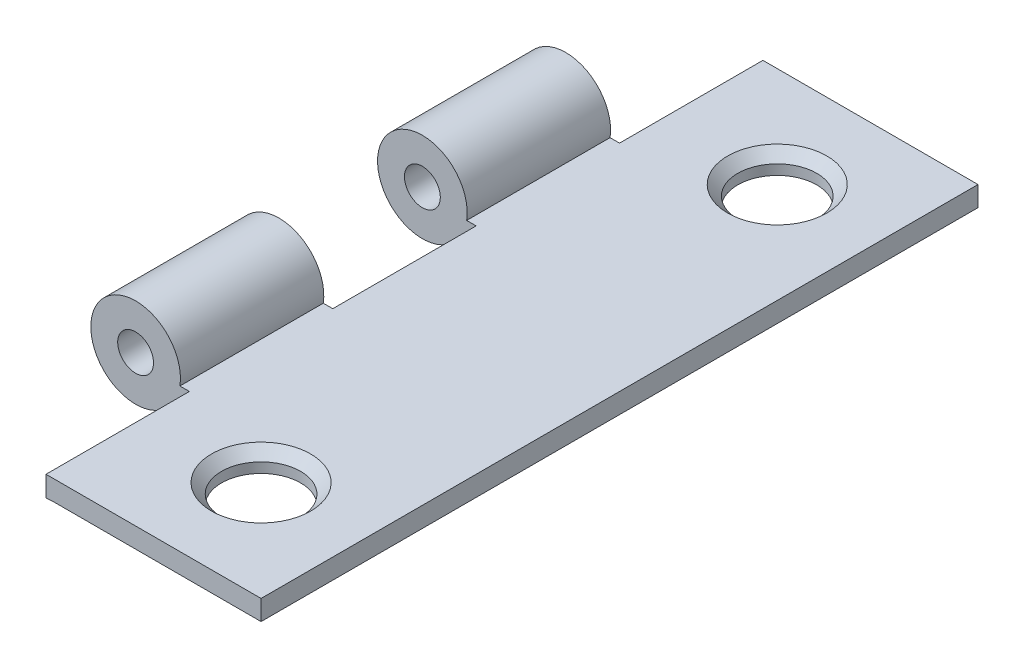
ISO-10303-21;
HEADER;
FILE_DESCRIPTION(('STEP AP214'),'2;1');
FILE_NAME('part.step','',(''),(''),'','','');
FILE_SCHEMA(('AUTOMOTIVE_DESIGN { 1 0 10303 214 1 1 1 1 }'));
ENDSEC;
DATA;
#1=APPLICATION_CONTEXT('core data for automotive mechanical design processes');
#2=APPLICATION_PROTOCOL_DEFINITION('international standard','automotive_design',2000,#1);
#3=PRODUCT_CONTEXT('',#1,'mechanical');
#4=PRODUCT('Part','Part','',(#3));
#5=PRODUCT_RELATED_PRODUCT_CATEGORY('part','',(#4));
#6=PRODUCT_DEFINITION_FORMATION('','',#4);
#7=PRODUCT_DEFINITION_CONTEXT('part definition',#1,'design');
#8=PRODUCT_DEFINITION('design','',#6,#7);
#9=PRODUCT_DEFINITION_SHAPE('','',#8);
#10=(LENGTH_UNIT() NAMED_UNIT(*) SI_UNIT(.MILLI.,.METRE.));
#11=(NAMED_UNIT(*) PLANE_ANGLE_UNIT() SI_UNIT($,.RADIAN.));
#12=(NAMED_UNIT(*) SI_UNIT($,.STERADIAN.) SOLID_ANGLE_UNIT());
#13=UNCERTAINTY_MEASURE_WITH_UNIT(LENGTH_MEASURE(1.E-05),#10,'distance_accuracy_value','');
#14=(GEOMETRIC_REPRESENTATION_CONTEXT(3) GLOBAL_UNCERTAINTY_ASSIGNED_CONTEXT((#13)) GLOBAL_UNIT_ASSIGNED_CONTEXT((#10,
#11,#12)) REPRESENTATION_CONTEXT('',''));
#15=CARTESIAN_POINT('',(0.,0.,0.));
#16=DIRECTION('',(0.,0.,1.));
#17=DIRECTION('',(1.,0.,0.));
#18=AXIS2_PLACEMENT_3D('',#15,#16,#17);
#19=CARTESIAN_POINT('',(0.,-0.4826,25.4));
#20=DIRECTION('',(0.,-1.,0.));
#21=DIRECTION('',(1.,0.,0.));
#22=AXIS2_PLACEMENT_3D('',#19,#20,#21);
#23=PLANE('',#22);
#24=CARTESIAN_POINT('',(11.9380000429728,-0.482599999999999,-18.288));
#25=DIRECTION('',(0.,-1.,0.));
#26=DIRECTION('',(1.,0.,0.));
#27=AXIS2_PLACEMENT_3D('',#24,#25,#26);
#28=CIRCLE('',#27,3.5112);
#29=CARTESIAN_POINT('',(15.4492000429728,-0.482599999999998,-18.288));
#30=VERTEX_POINT('',#29);
#31=EDGE_CURVE('E46',#30,#30,#28,.T.);
#32=ORIENTED_EDGE('',*,*,#31,.T.);
#33=EDGE_LOOP('',(#32));
#34=FACE_BOUND('',#33,.T.);
#35=CARTESIAN_POINT('',(11.9380000429728,-0.482599999999999,18.288));
#36=DIRECTION('',(0.,-1.,0.));
#37=DIRECTION('',(1.,0.,0.));
#38=AXIS2_PLACEMENT_3D('',#35,#36,#37);
#39=CIRCLE('',#38,3.5112);
#40=CARTESIAN_POINT('',(15.4492000429728,-0.482599999999998,18.288));
#41=VERTEX_POINT('',#40);
#42=EDGE_CURVE('E240',#41,#41,#39,.T.);
#43=ORIENTED_EDGE('',*,*,#42,.T.);
#44=EDGE_LOOP('',(#43));
#45=FACE_BOUND('',#44,.T.);
#46=DIRECTION('',(-1.,0.,0.));
#47=VECTOR('',#46,1.);
#48=CARTESIAN_POINT('',(0.,-0.4826,15.24));
#49=LINE('',#48,#47);
#50=CARTESIAN_POINT('',(3.81,-0.4826,15.24));
#51=VERTEX_POINT('',#50);
#52=CARTESIAN_POINT('',(3.13810806697284,-0.4826,15.24));
#53=VERTEX_POINT('',#52);
#54=EDGE_CURVE('E178',#51,#53,#49,.T.);
#55=ORIENTED_EDGE('',*,*,#54,.F.);
#56=DIRECTION('',(0.,0.,-1.));
#57=VECTOR('',#56,1.);
#58=CARTESIAN_POINT('',(3.81000000000001,-0.4826,25.4));
#59=LINE('',#58,#57);
#60=CARTESIAN_POINT('',(3.81000000000001,-0.482599999999999,25.4));
#61=VERTEX_POINT('',#60);
#62=EDGE_CURVE('E174',#61,#51,#59,.T.);
#63=ORIENTED_EDGE('',*,*,#62,.F.);
#64=DIRECTION('',(-1.,0.,0.));
#65=VECTOR('',#64,1.);
#66=CARTESIAN_POINT('',(0.,-0.4826,25.4));
#67=LINE('',#66,#65);
#68=CARTESIAN_POINT('',(19.0500000429728,-0.482599999999998,25.4));
#69=VERTEX_POINT('',#68);
#70=EDGE_CURVE('E192',#69,#61,#67,.T.);
#71=ORIENTED_EDGE('',*,*,#70,.F.);
#72=DIRECTION('',(0.,0.,-1.));
#73=VECTOR('',#72,1.);
#74=CARTESIAN_POINT('',(19.0500000429728,-0.482599999999998,25.4));
#75=LINE('',#74,#73);
#76=CARTESIAN_POINT('',(19.0500000429728,-0.482599999999998,-25.4));
#77=VERTEX_POINT('',#76);
#78=EDGE_CURVE('E203',#69,#77,#75,.T.);
#79=ORIENTED_EDGE('',*,*,#78,.T.);
#80=DIRECTION('',(-1.,0.,0.));
#81=VECTOR('',#80,1.);
#82=CARTESIAN_POINT('',(0.,-0.4826,-25.4));
#83=LINE('',#82,#81);
#84=CARTESIAN_POINT('',(3.81,-0.482599999999999,-25.4));
#85=VERTEX_POINT('',#84);
#86=EDGE_CURVE('E159',#77,#85,#83,.T.);
#87=ORIENTED_EDGE('',*,*,#86,.T.);
#88=DIRECTION('',(0.,0.,-1.));
#89=VECTOR('',#88,1.);
#90=CARTESIAN_POINT('',(3.81000000000001,-0.4826,25.4));
#91=LINE('',#90,#89);
#92=CARTESIAN_POINT('',(3.81,-0.4826,-15.24));
#93=VERTEX_POINT('',#92);
#94=EDGE_CURVE('E144',#93,#85,#91,.T.);
#95=ORIENTED_EDGE('',*,*,#94,.F.);
#96=DIRECTION('',(-1.,0.,0.));
#97=VECTOR('',#96,1.);
#98=CARTESIAN_POINT('',(0.,-0.4826,-15.24));
#99=LINE('',#98,#97);
#100=CARTESIAN_POINT('',(3.13810806697284,-0.4826,-15.24));
#101=VERTEX_POINT('',#100);
#102=EDGE_CURVE('E133',#93,#101,#99,.T.);
#103=ORIENTED_EDGE('',*,*,#102,.T.);
#104=DIRECTION('',(0.,0.,-1.));
#105=VECTOR('',#104,1.);
#106=CARTESIAN_POINT('',(3.13810806697284,-0.4826,25.4));
#107=LINE('',#106,#105);
#108=CARTESIAN_POINT('',(3.13810806697284,-0.4826,-5.08));
#109=VERTEX_POINT('',#108);
#110=EDGE_CURVE('E195',#109,#101,#107,.T.);
#111=ORIENTED_EDGE('',*,*,#110,.F.);
#112=DIRECTION('',(-1.,0.,0.));
#113=VECTOR('',#112,1.);
#114=CARTESIAN_POINT('',(0.,-0.4826,-5.08));
#115=LINE('',#114,#113);
#116=CARTESIAN_POINT('',(3.81,-0.4826,-5.08));
#117=VERTEX_POINT('',#116);
#118=EDGE_CURVE('E172',#117,#109,#115,.T.);
#119=ORIENTED_EDGE('',*,*,#118,.F.);
#120=DIRECTION('',(0.,0.,-1.));
#121=VECTOR('',#120,1.);
#122=CARTESIAN_POINT('',(3.81000000000001,-0.4826,25.4));
#123=LINE('',#122,#121);
#124=CARTESIAN_POINT('',(3.81,-0.4826,5.08));
#125=VERTEX_POINT('',#124);
#126=EDGE_CURVE('E168',#125,#117,#123,.T.);
#127=ORIENTED_EDGE('',*,*,#126,.F.);
#128=DIRECTION('',(-1.,0.,0.));
#129=VECTOR('',#128,1.);
#130=CARTESIAN_POINT('',(0.,-0.4826,5.08));
#131=LINE('',#130,#129);
#132=CARTESIAN_POINT('',(3.13810806697284,-0.4826,5.08));
#133=VERTEX_POINT('',#132);
#134=EDGE_CURVE('E162',#125,#133,#131,.T.);
#135=ORIENTED_EDGE('',*,*,#134,.T.);
#136=EDGE_CURVE('E202',#53,#133,#107,.T.);
#137=ORIENTED_EDGE('',*,*,#136,.F.);
#138=EDGE_LOOP('',(#55,#63,#71,#79,#87,#95,#103,#111,#119,#127,#135,#137));
#139=FACE_BOUND('',#138,.T.);
#140=ADVANCED_FACE('F37',(#34,#45,#139),#23,.F.);
#141=CARTESIAN_POINT('',(0.,0.,25.4));
#142=DIRECTION('',(0.,0.,-1.));
#143=DIRECTION('',(-1.,0.,0.));
#144=AXIS2_PLACEMENT_3D('',#141,#142,#143);
#145=CYLINDRICAL_SURFACE('',#144,3.175);
#146=DIRECTION('',(0.,0.,-1.));
#147=VECTOR('',#146,1.);
#148=CARTESIAN_POINT('',(1.69208040431729,-2.68653846153846,25.4));
#149=LINE('',#148,#147);
#150=CARTESIAN_POINT('',(1.69208040431729,-2.68653846153846,5.08));
#151=VERTEX_POINT('',#150);
#152=CARTESIAN_POINT('',(1.69208040431729,-2.68653846153846,15.24));
#153=VERTEX_POINT('',#152);
#154=EDGE_CURVE('E210',#151,#153,#149,.F.);
#155=ORIENTED_EDGE('',*,*,#154,.T.);
#156=CARTESIAN_POINT('',(0.,0.,15.24));
#157=DIRECTION('',(0.,0.,1.));
#158=DIRECTION('',(1.,0.,0.));
#159=AXIS2_PLACEMENT_3D('',#156,#157,#158);
#160=CIRCLE('',#159,3.175);
#161=EDGE_CURVE('E176',#53,#153,#160,.T.);
#162=ORIENTED_EDGE('',*,*,#161,.F.);
#163=ORIENTED_EDGE('',*,*,#136,.T.);
#164=CARTESIAN_POINT('',(0.,0.,5.08));
#165=DIRECTION('',(0.,0.,1.));
#166=DIRECTION('',(1.,0.,0.));
#167=AXIS2_PLACEMENT_3D('',#164,#165,#166);
#168=CIRCLE('',#167,3.175);
#169=EDGE_CURVE('E160',#133,#151,#168,.T.);
#170=ORIENTED_EDGE('',*,*,#169,.T.);
#171=EDGE_LOOP('',(#155,#162,#163,#170));
#172=FACE_BOUND('',#171,.T.);
#173=ADVANCED_FACE('F313',(#172),#145,.T.);
#174=CARTESIAN_POINT('',(1.69208040431729,-2.68653846153846,-15.24));
#175=VERTEX_POINT('',#174);
#176=CARTESIAN_POINT('',(1.69208040431729,-2.68653846153846,-5.08));
#177=VERTEX_POINT('',#176);
#178=EDGE_CURVE('E213',#175,#177,#149,.F.);
#179=ORIENTED_EDGE('',*,*,#178,.T.);
#180=CARTESIAN_POINT('',(0.,0.,-5.08));
#181=DIRECTION('',(0.,0.,1.));
#182=DIRECTION('',(1.,0.,0.));
#183=AXIS2_PLACEMENT_3D('',#180,#181,#182);
#184=CIRCLE('',#183,3.175);
#185=EDGE_CURVE('E170',#109,#177,#184,.T.);
#186=ORIENTED_EDGE('',*,*,#185,.F.);
#187=ORIENTED_EDGE('',*,*,#110,.T.);
#188=CARTESIAN_POINT('',(0.,0.,-15.24));
#189=DIRECTION('',(0.,0.,1.));
#190=DIRECTION('',(1.,0.,0.));
#191=AXIS2_PLACEMENT_3D('',#188,#189,#190);
#192=CIRCLE('',#191,3.175);
#193=EDGE_CURVE('E139',#101,#175,#192,.T.);
#194=ORIENTED_EDGE('',*,*,#193,.T.);
#195=EDGE_LOOP('',(#179,#186,#187,#194));
#196=FACE_BOUND('',#195,.T.);
#197=ADVANCED_FACE('F297',(#196),#145,.T.);
#198=CARTESIAN_POINT('',(0.,0.,25.4));
#199=DIRECTION('',(0.,0.,1.));
#200=DIRECTION('',(1.,0.,0.));
#201=AXIS2_PLACEMENT_3D('',#198,#199,#200);
#202=PLANE('',#201);
#203=ORIENTED_EDGE('',*,*,#70,.T.);
#204=DIRECTION('',(0.,1.,0.));
#205=VECTOR('',#204,1.);
#206=CARTESIAN_POINT('',(3.81000000000001,-3.175,25.4));
#207=LINE('',#206,#205);
#208=CARTESIAN_POINT('',(3.81000000000001,-1.93930906908339,25.4));
#209=VERTEX_POINT('',#208);
#210=EDGE_CURVE('E286',#209,#61,#207,.T.);
#211=ORIENTED_EDGE('',*,*,#210,.F.);
#212=CARTESIAN_POINT('',(4.39940905122495,-6.985,25.4));
#213=DIRECTION('',(0.,0.,1.));
#214=DIRECTION('',(1.,0.,0.));
#215=AXIS2_PLACEMENT_3D('',#212,#213,#214);
#216=CIRCLE('',#215,5.08);
#217=CARTESIAN_POINT('',(4.39940905122495,-1.905,25.4));
#218=VERTEX_POINT('',#217);
#219=EDGE_CURVE('E217',#209,#218,#216,.F.);
#220=ORIENTED_EDGE('',*,*,#219,.T.);
#221=DIRECTION('',(-1.,0.,0.));
#222=VECTOR('',#221,1.);
#223=CARTESIAN_POINT('',(0.,-1.905,25.4));
#224=LINE('',#223,#222);
#225=CARTESIAN_POINT('',(19.0500000429728,-1.905,25.4));
#226=VERTEX_POINT('',#225);
#227=EDGE_CURVE('E187',#226,#218,#224,.T.);
#228=ORIENTED_EDGE('',*,*,#227,.F.);
#229=DIRECTION('',(0.,1.,0.));
#230=VECTOR('',#229,1.);
#231=CARTESIAN_POINT('',(19.0500000429728,0.,25.4));
#232=LINE('',#231,#230);
#233=EDGE_CURVE('E190',#226,#69,#232,.T.);
#234=ORIENTED_EDGE('',*,*,#233,.T.);
#235=EDGE_LOOP('',(#203,#211,#220,#228,#234));
#236=FACE_BOUND('',#235,.T.);
#237=ADVANCED_FACE('F285',(#236),#202,.T.);
#238=CARTESIAN_POINT('',(0.,0.,-25.4));
#239=DIRECTION('',(0.,0.,1.));
#240=DIRECTION('',(1.,0.,0.));
#241=AXIS2_PLACEMENT_3D('',#238,#239,#240);
#242=PLANE('',#241);
#243=DIRECTION('',(0.,1.,0.));
#244=VECTOR('',#243,1.);
#245=CARTESIAN_POINT('',(3.81,-3.175,-25.4));
#246=LINE('',#245,#244);
#247=CARTESIAN_POINT('',(3.81,-1.93930906908339,-25.4));
#248=VERTEX_POINT('',#247);
#249=EDGE_CURVE('E152',#248,#85,#246,.T.);
#250=ORIENTED_EDGE('',*,*,#249,.T.);
#251=ORIENTED_EDGE('',*,*,#86,.F.);
#252=DIRECTION('',(0.,1.,0.));
#253=VECTOR('',#252,1.);
#254=CARTESIAN_POINT('',(19.0500000429728,0.,-25.4));
#255=LINE('',#254,#253);
#256=CARTESIAN_POINT('',(19.0500000429728,-1.905,-25.4));
#257=VERTEX_POINT('',#256);
#258=EDGE_CURVE('E198',#257,#77,#255,.T.);
#259=ORIENTED_EDGE('',*,*,#258,.F.);
#260=DIRECTION('',(-1.,0.,0.));
#261=VECTOR('',#260,1.);
#262=CARTESIAN_POINT('',(0.,-1.905,-25.4));
#263=LINE('',#262,#261);
#264=CARTESIAN_POINT('',(4.39940905122495,-1.905,-25.4));
#265=VERTEX_POINT('',#264);
#266=EDGE_CURVE('E186',#257,#265,#263,.T.);
#267=ORIENTED_EDGE('',*,*,#266,.T.);
#268=CARTESIAN_POINT('',(4.39940905122495,-6.985,-25.4));
#269=DIRECTION('',(0.,0.,1.));
#270=DIRECTION('',(1.,0.,0.));
#271=AXIS2_PLACEMENT_3D('',#268,#269,#270);
#272=CIRCLE('',#271,5.08);
#273=EDGE_CURVE('E214',#265,#248,#272,.T.);
#274=ORIENTED_EDGE('',*,*,#273,.T.);
#275=EDGE_LOOP('',(#250,#251,#259,#267,#274));
#276=FACE_BOUND('',#275,.T.);
#277=ADVANCED_FACE('F278',(#276),#242,.F.);
#278=CARTESIAN_POINT('',(4.39940905122495,-6.985,25.4));
#279=DIRECTION('',(0.,0.,-1.));
#280=DIRECTION('',(-1.,0.,0.));
#281=AXIS2_PLACEMENT_3D('',#278,#279,#280);
#282=CYLINDRICAL_SURFACE('',#281,5.08);
#283=CARTESIAN_POINT('',(4.39940905122495,-6.985,15.24));
#284=DIRECTION('',(0.,0.,1.));
#285=DIRECTION('',(1.,0.,0.));
#286=AXIS2_PLACEMENT_3D('',#283,#284,#285);
#287=CIRCLE('',#286,5.08);
#288=CARTESIAN_POINT('',(3.81000000000001,-1.93930906908339,15.24));
#289=VERTEX_POINT('',#288);
#290=EDGE_CURVE('E231',#153,#289,#287,.F.);
#291=ORIENTED_EDGE('',*,*,#290,.F.);
#292=ORIENTED_EDGE('',*,*,#154,.F.);
#293=CARTESIAN_POINT('',(4.39940905122495,-6.985,5.08));
#294=DIRECTION('',(0.,0.,1.));
#295=DIRECTION('',(1.,0.,0.));
#296=AXIS2_PLACEMENT_3D('',#293,#294,#295);
#297=CIRCLE('',#296,5.08);
#298=CARTESIAN_POINT('',(3.81,-1.93930906908339,5.08));
#299=VERTEX_POINT('',#298);
#300=EDGE_CURVE('E222',#151,#299,#297,.F.);
#301=ORIENTED_EDGE('',*,*,#300,.T.);
#302=DIRECTION('',(0.,0.,-1.));
#303=VECTOR('',#302,1.);
#304=CARTESIAN_POINT('',(3.81000000000001,-1.93930906908339,25.4));
#305=LINE('',#304,#303);
#306=CARTESIAN_POINT('',(3.81,-1.93930906908339,-5.08));
#307=VERTEX_POINT('',#306);
#308=EDGE_CURVE('E225',#307,#299,#305,.F.);
#309=ORIENTED_EDGE('',*,*,#308,.F.);
#310=CARTESIAN_POINT('',(4.39940905122495,-6.985,-5.08));
#311=DIRECTION('',(0.,0.,1.));
#312=DIRECTION('',(1.,0.,0.));
#313=AXIS2_PLACEMENT_3D('',#310,#311,#312);
#314=CIRCLE('',#313,5.08);
#315=EDGE_CURVE('E227',#177,#307,#314,.F.);
#316=ORIENTED_EDGE('',*,*,#315,.F.);
#317=ORIENTED_EDGE('',*,*,#178,.F.);
#318=CARTESIAN_POINT('',(4.39940905122495,-6.985,-15.24));
#319=DIRECTION('',(0.,0.,1.));
#320=DIRECTION('',(1.,0.,0.));
#321=AXIS2_PLACEMENT_3D('',#318,#319,#320);
#322=CIRCLE('',#321,5.08);
#323=CARTESIAN_POINT('',(3.81,-1.93930906908339,-15.24));
#324=VERTEX_POINT('',#323);
#325=EDGE_CURVE('E219',#175,#324,#322,.F.);
#326=ORIENTED_EDGE('',*,*,#325,.T.);
#327=DIRECTION('',(0.,0.,-1.));
#328=VECTOR('',#327,1.);
#329=CARTESIAN_POINT('',(3.81000000000001,-1.93930906908339,25.4));
#330=LINE('',#329,#328);
#331=EDGE_CURVE('E150',#248,#324,#330,.F.);
#332=ORIENTED_EDGE('',*,*,#331,.F.);
#333=ORIENTED_EDGE('',*,*,#273,.F.);
#334=DIRECTION('',(0.,0.,-1.));
#335=VECTOR('',#334,1.);
#336=CARTESIAN_POINT('',(4.39940905122495,-1.905,25.4));
#337=LINE('',#336,#335);
#338=EDGE_CURVE('E207',#218,#265,#337,.T.);
#339=ORIENTED_EDGE('',*,*,#338,.F.);
#340=ORIENTED_EDGE('',*,*,#219,.F.);
#341=DIRECTION('',(0.,0.,-1.));
#342=VECTOR('',#341,1.);
#343=CARTESIAN_POINT('',(3.81000000000001,-1.93930906908339,25.4));
#344=LINE('',#343,#342);
#345=EDGE_CURVE('E229',#289,#209,#344,.F.);
#346=ORIENTED_EDGE('',*,*,#345,.F.);
#347=EDGE_LOOP('',(#291,#292,#301,#309,#316,#317,#326,#332,#333,#339,#340,#346));
#348=FACE_BOUND('',#347,.T.);
#349=ADVANCED_FACE('F264',(#348),#282,.F.);
#350=CARTESIAN_POINT('',(0.,-1.905,25.4));
#351=DIRECTION('',(0.,-1.,0.));
#352=DIRECTION('',(1.,0.,0.));
#353=AXIS2_PLACEMENT_3D('',#350,#351,#352);
#354=PLANE('',#353);
#355=CARTESIAN_POINT('',(11.9380000429728,-1.905,-18.288));
#356=DIRECTION('',(0.,-1.,0.));
#357=DIRECTION('',(1.,0.,0.));
#358=AXIS2_PLACEMENT_3D('',#355,#356,#357);
#359=CIRCLE('',#358,2.8);
#360=CARTESIAN_POINT('',(14.7380000429728,-1.905,-18.288));
#361=VERTEX_POINT('',#360);
#362=EDGE_CURVE('E180',#361,#361,#359,.T.);
#363=ORIENTED_EDGE('',*,*,#362,.F.);
#364=EDGE_LOOP('',(#363));
#365=FACE_BOUND('',#364,.T.);
#366=CARTESIAN_POINT('',(11.9380000429728,-1.905,18.288));
#367=DIRECTION('',(0.,-1.,0.));
#368=DIRECTION('',(1.,0.,0.));
#369=AXIS2_PLACEMENT_3D('',#366,#367,#368);
#370=CIRCLE('',#369,2.8);
#371=CARTESIAN_POINT('',(14.7380000429728,-1.905,18.288));
#372=VERTEX_POINT('',#371);
#373=EDGE_CURVE('E183',#372,#372,#370,.T.);
#374=ORIENTED_EDGE('',*,*,#373,.F.);
#375=EDGE_LOOP('',(#374));
#376=FACE_BOUND('',#375,.T.);
#377=ORIENTED_EDGE('',*,*,#227,.T.);
#378=ORIENTED_EDGE('',*,*,#338,.T.);
#379=ORIENTED_EDGE('',*,*,#266,.F.);
#380=DIRECTION('',(0.,0.,-1.));
#381=VECTOR('',#380,1.);
#382=CARTESIAN_POINT('',(19.0500000429728,-1.905,25.4));
#383=LINE('',#382,#381);
#384=EDGE_CURVE('E205',#226,#257,#383,.T.);
#385=ORIENTED_EDGE('',*,*,#384,.F.);
#386=EDGE_LOOP('',(#377,#378,#379,#385));
#387=FACE_BOUND('',#386,.T.);
#388=ADVANCED_FACE('F260',(#365,#376,#387),#354,.T.);
#389=CARTESIAN_POINT('',(19.0500000429728,0.,25.4));
#390=DIRECTION('',(-1.,0.,0.));
#391=DIRECTION('',(0.,0.,1.));
#392=AXIS2_PLACEMENT_3D('',#389,#390,#391);
#393=PLANE('',#392);
#394=ORIENTED_EDGE('',*,*,#258,.T.);
#395=ORIENTED_EDGE('',*,*,#78,.F.);
#396=ORIENTED_EDGE('',*,*,#233,.F.);
#397=ORIENTED_EDGE('',*,*,#384,.T.);
#398=EDGE_LOOP('',(#394,#395,#396,#397));
#399=FACE_BOUND('',#398,.T.);
#400=ADVANCED_FACE('F263',(#399),#393,.F.);
#401=CARTESIAN_POINT('',(11.9380000429728,-0.482599999999999,18.288));
#402=DIRECTION('',(0.,1.,0.));
#403=DIRECTION('',(0.,0.,1.));
#404=AXIS2_PLACEMENT_3D('',#401,#402,#403);
#405=CYLINDRICAL_SURFACE('',#404,2.8);
#406=CARTESIAN_POINT('',(11.9380000429728,-1.19379999999999,18.288));
#407=DIRECTION('',(0.,-1.,0.));
#408=DIRECTION('',(0.,0.,-1.));
#409=AXIS2_PLACEMENT_3D('',#406,#407,#408);
#410=CIRCLE('',#409,2.8);
#411=CARTESIAN_POINT('',(11.9380000429728,-1.19379999999999,15.488));
#412=VERTEX_POINT('',#411);
#413=EDGE_CURVE('E11',#412,#412,#410,.F.);
#414=ORIENTED_EDGE('',*,*,#413,.T.);
#415=EDGE_LOOP('',(#414));
#416=FACE_BOUND('',#415,.T.);
#417=ORIENTED_EDGE('',*,*,#373,.T.);
#418=EDGE_LOOP('',(#417));
#419=FACE_BOUND('',#418,.T.);
#420=ADVANCED_FACE('F256',(#416,#419),#405,.F.);
#421=CARTESIAN_POINT('',(11.9380000429728,-0.482599999999999,-18.288));
#422=DIRECTION('',(0.,1.,0.));
#423=DIRECTION('',(0.,0.,1.));
#424=AXIS2_PLACEMENT_3D('',#421,#422,#423);
#425=CYLINDRICAL_SURFACE('',#424,2.8);
#426=CARTESIAN_POINT('',(11.9380000429728,-1.19379999999999,-18.288));
#427=DIRECTION('',(0.,-1.,0.));
#428=DIRECTION('',(0.,0.,-1.));
#429=AXIS2_PLACEMENT_3D('',#426,#427,#428);
#430=CIRCLE('',#429,2.8);
#431=CARTESIAN_POINT('',(11.9380000429728,-1.19379999999999,-21.088));
#432=VERTEX_POINT('',#431);
#433=EDGE_CURVE('E233',#432,#432,#430,.F.);
#434=ORIENTED_EDGE('',*,*,#433,.T.);
#435=EDGE_LOOP('',(#434));
#436=FACE_BOUND('',#435,.T.);
#437=ORIENTED_EDGE('',*,*,#362,.T.);
#438=EDGE_LOOP('',(#437));
#439=FACE_BOUND('',#438,.T.);
#440=ADVANCED_FACE('F253',(#436,#439),#425,.F.);
#441=CARTESIAN_POINT('',(3.81,-3.175,0.));
#442=DIRECTION('',(-1.,0.,0.));
#443=DIRECTION('',(0.,0.,1.));
#444=AXIS2_PLACEMENT_3D('',#441,#442,#443);
#445=PLANE('',#444);
#446=ORIENTED_EDGE('',*,*,#94,.T.);
#447=ORIENTED_EDGE('',*,*,#249,.F.);
#448=ORIENTED_EDGE('',*,*,#331,.T.);
#449=DIRECTION('',(0.,1.,0.));
#450=VECTOR('',#449,1.);
#451=CARTESIAN_POINT('',(3.81,-3.175,-15.24));
#452=LINE('',#451,#450);
#453=EDGE_CURVE('E137',#324,#93,#452,.T.);
#454=ORIENTED_EDGE('',*,*,#453,.T.);
#455=EDGE_LOOP('',(#446,#447,#448,#454));
#456=FACE_BOUND('',#455,.T.);
#457=ADVANCED_FACE('F147',(#456),#445,.T.);
#458=CARTESIAN_POINT('',(0.,-3.175,-15.24));
#459=DIRECTION('',(0.,0.,1.));
#460=DIRECTION('',(1.,0.,0.));
#461=AXIS2_PLACEMENT_3D('',#458,#459,#460);
#462=PLANE('',#461);
#463=CARTESIAN_POINT('',(0.,0.,-15.24));
#464=DIRECTION('',(0.,0.,1.));
#465=DIRECTION('',(1.,0.,0.));
#466=AXIS2_PLACEMENT_3D('',#463,#464,#465);
#467=CIRCLE('',#466,1.27);
#468=CARTESIAN_POINT('',(1.27,0.,-15.24));
#469=VERTEX_POINT('',#468);
#470=EDGE_CURVE('E153',#469,#469,#467,.T.);
#471=ORIENTED_EDGE('',*,*,#470,.T.);
#472=EDGE_LOOP('',(#471));
#473=FACE_BOUND('',#472,.T.);
#474=ORIENTED_EDGE('',*,*,#453,.F.);
#475=ORIENTED_EDGE('',*,*,#325,.F.);
#476=ORIENTED_EDGE('',*,*,#193,.F.);
#477=ORIENTED_EDGE('',*,*,#102,.F.);
#478=EDGE_LOOP('',(#474,#475,#476,#477));
#479=FACE_BOUND('',#478,.T.);
#480=ADVANCED_FACE('F135',(#473,#479),#462,.F.);
#481=CARTESIAN_POINT('',(0.,-3.175,-5.08));
#482=DIRECTION('',(0.,0.,1.));
#483=DIRECTION('',(1.,0.,0.));
#484=AXIS2_PLACEMENT_3D('',#481,#482,#483);
#485=PLANE('',#484);
#486=CARTESIAN_POINT('',(0.,0.,-5.08));
#487=DIRECTION('',(0.,0.,1.));
#488=DIRECTION('',(1.,0.,0.));
#489=AXIS2_PLACEMENT_3D('',#486,#487,#488);
#490=CIRCLE('',#489,1.27);
#491=CARTESIAN_POINT('',(1.27,0.,-5.08));
#492=VERTEX_POINT('',#491);
#493=EDGE_CURVE('E377',#492,#492,#490,.T.);
#494=ORIENTED_EDGE('',*,*,#493,.F.);
#495=EDGE_LOOP('',(#494));
#496=FACE_BOUND('',#495,.T.);
#497=ORIENTED_EDGE('',*,*,#118,.T.);
#498=ORIENTED_EDGE('',*,*,#185,.T.);
#499=ORIENTED_EDGE('',*,*,#315,.T.);
#500=DIRECTION('',(0.,1.,0.));
#501=VECTOR('',#500,1.);
#502=CARTESIAN_POINT('',(3.81,-3.175,-5.08));
#503=LINE('',#502,#501);
#504=EDGE_CURVE('E287',#307,#117,#503,.T.);
#505=ORIENTED_EDGE('',*,*,#504,.T.);
#506=EDGE_LOOP('',(#497,#498,#499,#505));
#507=FACE_BOUND('',#506,.T.);
#508=ADVANCED_FACE('F304',(#496,#507),#485,.T.);
#509=CARTESIAN_POINT('',(3.81,-3.175,0.));
#510=DIRECTION('',(-1.,0.,0.));
#511=DIRECTION('',(0.,0.,1.));
#512=AXIS2_PLACEMENT_3D('',#509,#510,#511);
#513=PLANE('',#512);
#514=ORIENTED_EDGE('',*,*,#126,.T.);
#515=ORIENTED_EDGE('',*,*,#504,.F.);
#516=ORIENTED_EDGE('',*,*,#308,.T.);
#517=DIRECTION('',(0.,1.,0.));
#518=VECTOR('',#517,1.);
#519=CARTESIAN_POINT('',(3.81,-3.175,5.08));
#520=LINE('',#519,#518);
#521=EDGE_CURVE('E61',#299,#125,#520,.T.);
#522=ORIENTED_EDGE('',*,*,#521,.T.);
#523=EDGE_LOOP('',(#514,#515,#516,#522));
#524=FACE_BOUND('',#523,.T.);
#525=ADVANCED_FACE('F307',(#524),#513,.T.);
#526=CARTESIAN_POINT('',(0.,-3.175,5.08));
#527=DIRECTION('',(0.,0.,1.));
#528=DIRECTION('',(1.,0.,0.));
#529=AXIS2_PLACEMENT_3D('',#526,#527,#528);
#530=PLANE('',#529);
#531=CARTESIAN_POINT('',(0.,0.,5.08));
#532=DIRECTION('',(0.,0.,1.));
#533=DIRECTION('',(1.,0.,0.));
#534=AXIS2_PLACEMENT_3D('',#531,#532,#533);
#535=CIRCLE('',#534,1.27);
#536=CARTESIAN_POINT('',(1.27,0.,5.08));
#537=VERTEX_POINT('',#536);
#538=EDGE_CURVE('E237',#537,#537,#535,.T.);
#539=ORIENTED_EDGE('',*,*,#538,.T.);
#540=EDGE_LOOP('',(#539));
#541=FACE_BOUND('',#540,.T.);
#542=ORIENTED_EDGE('',*,*,#521,.F.);
#543=ORIENTED_EDGE('',*,*,#300,.F.);
#544=ORIENTED_EDGE('',*,*,#169,.F.);
#545=ORIENTED_EDGE('',*,*,#134,.F.);
#546=EDGE_LOOP('',(#542,#543,#544,#545));
#547=FACE_BOUND('',#546,.T.);
#548=ADVANCED_FACE('F327',(#541,#547),#530,.F.);
#549=CARTESIAN_POINT('',(0.,-3.175,15.24));
#550=DIRECTION('',(0.,0.,1.));
#551=DIRECTION('',(1.,0.,0.));
#552=AXIS2_PLACEMENT_3D('',#549,#550,#551);
#553=PLANE('',#552);
#554=CARTESIAN_POINT('',(0.,0.,15.24));
#555=DIRECTION('',(0.,0.,1.));
#556=DIRECTION('',(1.,0.,0.));
#557=AXIS2_PLACEMENT_3D('',#554,#555,#556);
#558=CIRCLE('',#557,1.27);
#559=CARTESIAN_POINT('',(1.27,0.,15.24));
#560=VERTEX_POINT('',#559);
#561=EDGE_CURVE('E234',#560,#560,#558,.T.);
#562=ORIENTED_EDGE('',*,*,#561,.F.);
#563=EDGE_LOOP('',(#562));
#564=FACE_BOUND('',#563,.T.);
#565=ORIENTED_EDGE('',*,*,#54,.T.);
#566=ORIENTED_EDGE('',*,*,#161,.T.);
#567=ORIENTED_EDGE('',*,*,#290,.T.);
#568=DIRECTION('',(0.,1.,0.));
#569=VECTOR('',#568,1.);
#570=CARTESIAN_POINT('',(3.81,-3.175,15.24));
#571=LINE('',#570,#569);
#572=EDGE_CURVE('E53',#289,#51,#571,.T.);
#573=ORIENTED_EDGE('',*,*,#572,.T.);
#574=EDGE_LOOP('',(#565,#566,#567,#573));
#575=FACE_BOUND('',#574,.T.);
#576=ADVANCED_FACE('F316',(#564,#575),#553,.T.);
#577=CARTESIAN_POINT('',(3.81,-3.175,0.));
#578=DIRECTION('',(-1.,0.,0.));
#579=DIRECTION('',(0.,0.,1.));
#580=AXIS2_PLACEMENT_3D('',#577,#578,#579);
#581=PLANE('',#580);
#582=ORIENTED_EDGE('',*,*,#62,.T.);
#583=ORIENTED_EDGE('',*,*,#572,.F.);
#584=ORIENTED_EDGE('',*,*,#345,.T.);
#585=ORIENTED_EDGE('',*,*,#210,.T.);
#586=EDGE_LOOP('',(#582,#583,#584,#585));
#587=FACE_BOUND('',#586,.T.);
#588=ADVANCED_FACE('F317',(#587),#581,.T.);
#589=CARTESIAN_POINT('',(0.,0.,-25.4));
#590=DIRECTION('',(0.,0.,1.));
#591=DIRECTION('',(1.,0.,0.));
#592=AXIS2_PLACEMENT_3D('',#589,#590,#591);
#593=CYLINDRICAL_SURFACE('',#592,1.27);
#594=ORIENTED_EDGE('',*,*,#561,.T.);
#595=EDGE_LOOP('',(#594));
#596=FACE_BOUND('',#595,.T.);
#597=ORIENTED_EDGE('',*,*,#538,.F.);
#598=EDGE_LOOP('',(#597));
#599=FACE_BOUND('',#598,.T.);
#600=ADVANCED_FACE('F319',(#596,#599),#593,.F.);
#601=ORIENTED_EDGE('',*,*,#493,.T.);
#602=EDGE_LOOP('',(#601));
#603=FACE_BOUND('',#602,.T.);
#604=ORIENTED_EDGE('',*,*,#470,.F.);
#605=EDGE_LOOP('',(#604));
#606=FACE_BOUND('',#605,.T.);
#607=ADVANCED_FACE('F250',(#603,#606),#593,.F.);
#608=CARTESIAN_POINT('',(11.9380000429728,-1.19379999999999,-18.288));
#609=DIRECTION('',(0.,1.,0.));
#610=DIRECTION('',(0.,0.,1.));
#611=AXIS2_PLACEMENT_3D('',#608,#609,#610);
#612=CONICAL_SURFACE('',#611,2.8,0.785398163397451);
#613=ORIENTED_EDGE('',*,*,#31,.F.);
#614=EDGE_LOOP('',(#613));
#615=FACE_BOUND('',#614,.T.);
#616=ORIENTED_EDGE('',*,*,#433,.F.);
#617=EDGE_LOOP('',(#616));
#618=FACE_BOUND('',#617,.T.);
#619=ADVANCED_FACE('F247',(#615,#618),#612,.F.);
#620=CARTESIAN_POINT('',(11.9380000429728,-1.19379999999999,18.288));
#621=DIRECTION('',(0.,1.,0.));
#622=DIRECTION('',(0.,0.,1.));
#623=AXIS2_PLACEMENT_3D('',#620,#621,#622);
#624=CONICAL_SURFACE('',#623,2.8,0.78539816339745);
#625=ORIENTED_EDGE('',*,*,#42,.F.);
#626=EDGE_LOOP('',(#625));
#627=FACE_BOUND('',#626,.T.);
#628=ORIENTED_EDGE('',*,*,#413,.F.);
#629=EDGE_LOOP('',(#628));
#630=FACE_BOUND('',#629,.T.);
#631=ADVANCED_FACE('F40',(#627,#630),#624,.F.);
#632=CLOSED_SHELL('',(#140,#173,#197,#237,#277,#349,#388,#400,#420,#440,#457,#480,#508,#525,
#548,#576,#588,#600,#607,#619,#631));
#633=MANIFOLD_SOLID_BREP('B2',#632);
#634=ADVANCED_BREP_SHAPE_REPRESENTATION('',(#18,#633),#14);
#635=SHAPE_DEFINITION_REPRESENTATION(#9,#634);
ENDSEC;
END-ISO-10303-21;
